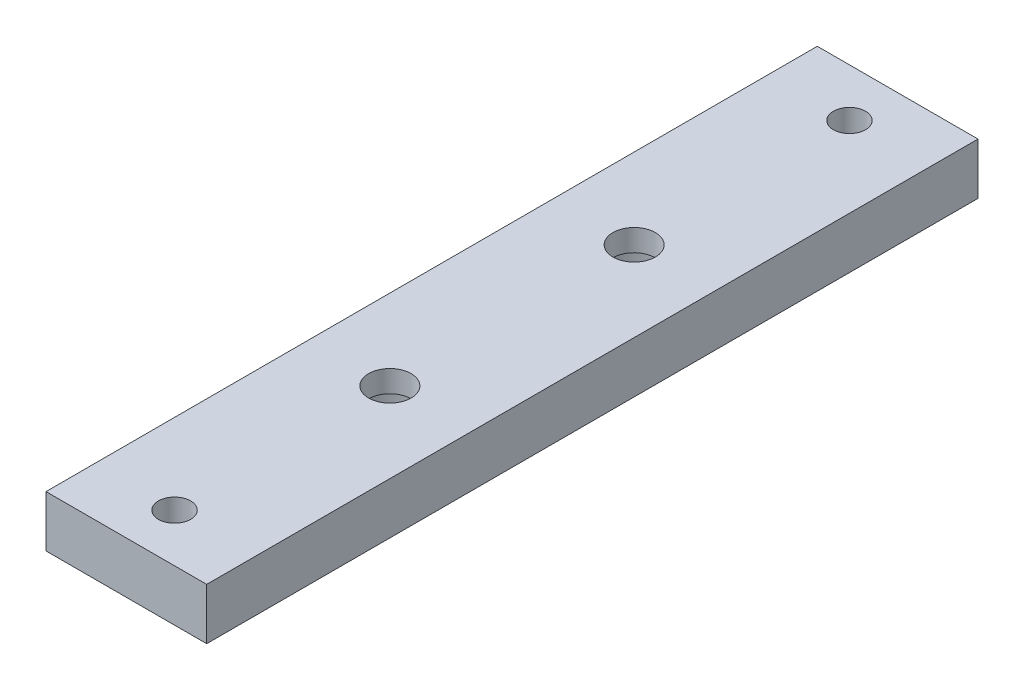
ISO-10303-21;
HEADER;
FILE_DESCRIPTION(('STEP AP214'),'2;1');
FILE_NAME('part.step','',(''),(''),'','','');
FILE_SCHEMA(('AUTOMOTIVE_DESIGN { 1 0 10303 214 1 1 1 1 }'));
ENDSEC;
DATA;
#1=APPLICATION_CONTEXT('core data for automotive mechanical design processes');
#2=APPLICATION_PROTOCOL_DEFINITION('international standard','automotive_design',2000,#1);
#3=PRODUCT_CONTEXT('',#1,'mechanical');
#4=PRODUCT('Part','Part','',(#3));
#5=PRODUCT_RELATED_PRODUCT_CATEGORY('part','',(#4));
#6=PRODUCT_DEFINITION_FORMATION('','',#4);
#7=PRODUCT_DEFINITION_CONTEXT('part definition',#1,'design');
#8=PRODUCT_DEFINITION('design','',#6,#7);
#9=PRODUCT_DEFINITION_SHAPE('','',#8);
#10=(LENGTH_UNIT() NAMED_UNIT(*) SI_UNIT(.MILLI.,.METRE.));
#11=(NAMED_UNIT(*) PLANE_ANGLE_UNIT() SI_UNIT($,.RADIAN.));
#12=(NAMED_UNIT(*) SI_UNIT($,.STERADIAN.) SOLID_ANGLE_UNIT());
#13=UNCERTAINTY_MEASURE_WITH_UNIT(LENGTH_MEASURE(1.E-05),#10,'distance_accuracy_value','');
#14=(GEOMETRIC_REPRESENTATION_CONTEXT(3) GLOBAL_UNCERTAINTY_ASSIGNED_CONTEXT((#13)) GLOBAL_UNIT_ASSIGNED_CONTEXT((#10,
#11,#12)) REPRESENTATION_CONTEXT('',''));
#15=CARTESIAN_POINT('',(0.,0.,0.));
#16=DIRECTION('',(0.,0.,1.));
#17=DIRECTION('',(1.,0.,0.));
#18=AXIS2_PLACEMENT_3D('',#15,#16,#17);
#19=CARTESIAN_POINT('',(12.5,8.,-60.));
#20=DIRECTION('',(-1.,0.,0.));
#21=DIRECTION('',(0.,0.,1.));
#22=AXIS2_PLACEMENT_3D('',#19,#20,#21);
#23=PLANE('',#22);
#24=DIRECTION('',(0.,0.,-1.));
#25=VECTOR('',#24,1.);
#26=CARTESIAN_POINT('',(12.5,0.,-60.));
#27=LINE('',#26,#25);
#28=CARTESIAN_POINT('',(12.5,0.,60.));
#29=VERTEX_POINT('',#28);
#30=CARTESIAN_POINT('',(12.5,0.,-60.));
#31=VERTEX_POINT('',#30);
#32=EDGE_CURVE('E98',#29,#31,#27,.T.);
#33=ORIENTED_EDGE('',*,*,#32,.T.);
#34=DIRECTION('',(0.,-1.,0.));
#35=VECTOR('',#34,1.);
#36=CARTESIAN_POINT('',(12.5,8.,-60.));
#37=LINE('',#36,#35);
#38=CARTESIAN_POINT('',(12.5,8.,-60.));
#39=VERTEX_POINT('',#38);
#40=EDGE_CURVE('E11',#39,#31,#37,.T.);
#41=ORIENTED_EDGE('',*,*,#40,.F.);
#42=DIRECTION('',(0.,0.,-1.));
#43=VECTOR('',#42,1.);
#44=CARTESIAN_POINT('',(12.5,8.,-60.));
#45=LINE('',#44,#43);
#46=CARTESIAN_POINT('',(12.5,8.,60.));
#47=VERTEX_POINT('',#46);
#48=EDGE_CURVE('E86',#47,#39,#45,.T.);
#49=ORIENTED_EDGE('',*,*,#48,.F.);
#50=DIRECTION('',(0.,-1.,0.));
#51=VECTOR('',#50,1.);
#52=CARTESIAN_POINT('',(12.5,8.,60.));
#53=LINE('',#52,#51);
#54=EDGE_CURVE('E94',#47,#29,#53,.T.);
#55=ORIENTED_EDGE('',*,*,#54,.T.);
#56=EDGE_LOOP('',(#33,#41,#49,#55));
#57=FACE_BOUND('',#56,.T.);
#58=ADVANCED_FACE('F35',(#57),#23,.F.);
#59=CARTESIAN_POINT('',(-12.5,8.,-60.));
#60=DIRECTION('',(0.,0.,1.));
#61=DIRECTION('',(1.,0.,0.));
#62=AXIS2_PLACEMENT_3D('',#59,#60,#61);
#63=PLANE('',#62);
#64=DIRECTION('',(-1.,0.,0.));
#65=VECTOR('',#64,1.);
#66=CARTESIAN_POINT('',(-12.5,0.,-60.));
#67=LINE('',#66,#65);
#68=CARTESIAN_POINT('',(-12.5,0.,-60.));
#69=VERTEX_POINT('',#68);
#70=EDGE_CURVE('E90',#31,#69,#67,.T.);
#71=ORIENTED_EDGE('',*,*,#70,.T.);
#72=DIRECTION('',(0.,-1.,0.));
#73=VECTOR('',#72,1.);
#74=CARTESIAN_POINT('',(-12.5,8.,-60.));
#75=LINE('',#74,#73);
#76=CARTESIAN_POINT('',(-12.5,8.,-60.));
#77=VERTEX_POINT('',#76);
#78=EDGE_CURVE('E43',#77,#69,#75,.T.);
#79=ORIENTED_EDGE('',*,*,#78,.F.);
#80=DIRECTION('',(-1.,0.,0.));
#81=VECTOR('',#80,1.);
#82=CARTESIAN_POINT('',(-12.5,8.,-60.));
#83=LINE('',#82,#81);
#84=EDGE_CURVE('E81',#39,#77,#83,.T.);
#85=ORIENTED_EDGE('',*,*,#84,.F.);
#86=ORIENTED_EDGE('',*,*,#40,.T.);
#87=EDGE_LOOP('',(#71,#79,#85,#86));
#88=FACE_BOUND('',#87,.T.);
#89=ADVANCED_FACE('F89',(#88),#63,.F.);
#90=CARTESIAN_POINT('',(-12.5,8.,-60.));
#91=DIRECTION('',(1.,0.,0.));
#92=DIRECTION('',(0.,0.,-1.));
#93=AXIS2_PLACEMENT_3D('',#90,#91,#92);
#94=PLANE('',#93);
#95=DIRECTION('',(0.,0.,1.));
#96=VECTOR('',#95,1.);
#97=CARTESIAN_POINT('',(-12.5,0.,-60.));
#98=LINE('',#97,#96);
#99=CARTESIAN_POINT('',(-12.5,0.,60.));
#100=VERTEX_POINT('',#99);
#101=EDGE_CURVE('E68',#69,#100,#98,.T.);
#102=ORIENTED_EDGE('',*,*,#101,.T.);
#103=DIRECTION('',(0.,-1.,0.));
#104=VECTOR('',#103,1.);
#105=CARTESIAN_POINT('',(-12.5,8.,60.));
#106=LINE('',#105,#104);
#107=CARTESIAN_POINT('',(-12.5,8.,60.));
#108=VERTEX_POINT('',#107);
#109=EDGE_CURVE('E91',#108,#100,#106,.T.);
#110=ORIENTED_EDGE('',*,*,#109,.F.);
#111=DIRECTION('',(0.,0.,1.));
#112=VECTOR('',#111,1.);
#113=CARTESIAN_POINT('',(-12.5,8.,-60.));
#114=LINE('',#113,#112);
#115=EDGE_CURVE('E84',#77,#108,#114,.T.);
#116=ORIENTED_EDGE('',*,*,#115,.F.);
#117=ORIENTED_EDGE('',*,*,#78,.T.);
#118=EDGE_LOOP('',(#102,#110,#116,#117));
#119=FACE_BOUND('',#118,.T.);
#120=ADVANCED_FACE('F92',(#119),#94,.F.);
#121=CARTESIAN_POINT('',(-12.5,8.,60.));
#122=DIRECTION('',(0.,0.,-1.));
#123=DIRECTION('',(-1.,0.,0.));
#124=AXIS2_PLACEMENT_3D('',#121,#122,#123);
#125=PLANE('',#124);
#126=DIRECTION('',(1.,0.,0.));
#127=VECTOR('',#126,1.);
#128=CARTESIAN_POINT('',(-12.5,0.,60.));
#129=LINE('',#128,#127);
#130=EDGE_CURVE('E74',#100,#29,#129,.T.);
#131=ORIENTED_EDGE('',*,*,#130,.T.);
#132=ORIENTED_EDGE('',*,*,#54,.F.);
#133=DIRECTION('',(1.,0.,0.));
#134=VECTOR('',#133,1.);
#135=CARTESIAN_POINT('',(-12.5,8.,60.));
#136=LINE('',#135,#134);
#137=EDGE_CURVE('E51',#108,#47,#136,.T.);
#138=ORIENTED_EDGE('',*,*,#137,.F.);
#139=ORIENTED_EDGE('',*,*,#109,.T.);
#140=EDGE_LOOP('',(#131,#132,#138,#139));
#141=FACE_BOUND('',#140,.T.);
#142=ADVANCED_FACE('F106',(#141),#125,.F.);
#143=CARTESIAN_POINT('',(0.,8.,0.));
#144=DIRECTION('',(0.,1.,0.));
#145=DIRECTION('',(0.,0.,1.));
#146=AXIS2_PLACEMENT_3D('',#143,#144,#145);
#147=PLANE('',#146);
#148=CARTESIAN_POINT('',(0.,8.,19.));
#149=DIRECTION('',(0.,-1.,0.));
#150=DIRECTION('',(0.,0.,-1.));
#151=AXIS2_PLACEMENT_3D('',#148,#149,#150);
#152=CIRCLE('',#151,3.3);
#153=CARTESIAN_POINT('',(0.,8.,15.7));
#154=VERTEX_POINT('',#153);
#155=EDGE_CURVE('E147',#154,#154,#152,.T.);
#156=ORIENTED_EDGE('',*,*,#155,.T.);
#157=EDGE_LOOP('',(#156));
#158=FACE_BOUND('',#157,.T.);
#159=CARTESIAN_POINT('',(0.,8.,-19.));
#160=DIRECTION('',(0.,-1.,0.));
#161=DIRECTION('',(0.,0.,-1.));
#162=AXIS2_PLACEMENT_3D('',#159,#160,#161);
#163=CIRCLE('',#162,3.3);
#164=CARTESIAN_POINT('',(0.,8.,-22.3));
#165=VERTEX_POINT('',#164);
#166=EDGE_CURVE('E135',#165,#165,#163,.T.);
#167=ORIENTED_EDGE('',*,*,#166,.T.);
#168=EDGE_LOOP('',(#167));
#169=FACE_BOUND('',#168,.T.);
#170=CARTESIAN_POINT('',(0.,8.,52.5));
#171=DIRECTION('',(0.,1.,0.));
#172=DIRECTION('',(0.,0.,1.));
#173=AXIS2_PLACEMENT_3D('',#170,#171,#172);
#174=CIRCLE('',#173,2.49999999999999);
#175=CARTESIAN_POINT('',(0.,8.,55.));
#176=VERTEX_POINT('',#175);
#177=EDGE_CURVE('E120',#176,#176,#174,.T.);
#178=ORIENTED_EDGE('',*,*,#177,.F.);
#179=EDGE_LOOP('',(#178));
#180=FACE_BOUND('',#179,.T.);
#181=CARTESIAN_POINT('',(0.,8.,-52.5));
#182=DIRECTION('',(0.,1.,0.));
#183=DIRECTION('',(0.,0.,1.));
#184=AXIS2_PLACEMENT_3D('',#181,#182,#183);
#185=CIRCLE('',#184,2.49999999999999);
#186=CARTESIAN_POINT('',(0.,8.,-50.));
#187=VERTEX_POINT('',#186);
#188=EDGE_CURVE('E114',#187,#187,#185,.T.);
#189=ORIENTED_EDGE('',*,*,#188,.F.);
#190=EDGE_LOOP('',(#189));
#191=FACE_BOUND('',#190,.T.);
#192=ORIENTED_EDGE('',*,*,#48,.T.);
#193=ORIENTED_EDGE('',*,*,#84,.T.);
#194=ORIENTED_EDGE('',*,*,#115,.T.);
#195=ORIENTED_EDGE('',*,*,#137,.T.);
#196=EDGE_LOOP('',(#192,#193,#194,#195));
#197=FACE_BOUND('',#196,.T.);
#198=ADVANCED_FACE('F82',(#158,#169,#180,#191,#197),#147,.T.);
#199=CARTESIAN_POINT('',(0.,0.,0.));
#200=DIRECTION('',(0.,1.,0.));
#201=DIRECTION('',(0.,0.,1.));
#202=AXIS2_PLACEMENT_3D('',#199,#200,#201);
#203=PLANE('',#202);
#204=CARTESIAN_POINT('',(0.,0.,19.));
#205=DIRECTION('',(0.,-1.,0.));
#206=DIRECTION('',(0.,0.,-1.));
#207=AXIS2_PLACEMENT_3D('',#204,#205,#206);
#208=CIRCLE('',#207,7.);
#209=CARTESIAN_POINT('',(0.,0.,12.));
#210=VERTEX_POINT('',#209);
#211=EDGE_CURVE('E156',#210,#210,#208,.T.);
#212=ORIENTED_EDGE('',*,*,#211,.F.);
#213=EDGE_LOOP('',(#212));
#214=FACE_BOUND('',#213,.T.);
#215=CARTESIAN_POINT('',(0.,0.,-19.));
#216=DIRECTION('',(0.,-1.,0.));
#217=DIRECTION('',(0.,0.,-1.));
#218=AXIS2_PLACEMENT_3D('',#215,#216,#217);
#219=CIRCLE('',#218,7.);
#220=CARTESIAN_POINT('',(0.,0.,-26.));
#221=VERTEX_POINT('',#220);
#222=EDGE_CURVE('E144',#221,#221,#219,.T.);
#223=ORIENTED_EDGE('',*,*,#222,.F.);
#224=EDGE_LOOP('',(#223));
#225=FACE_BOUND('',#224,.T.);
#226=CARTESIAN_POINT('',(0.,0.,52.5));
#227=DIRECTION('',(0.,-1.,0.));
#228=DIRECTION('',(0.,0.,-1.));
#229=AXIS2_PLACEMENT_3D('',#226,#227,#228);
#230=CIRCLE('',#229,2.);
#231=CARTESIAN_POINT('',(0.,0.,50.5));
#232=VERTEX_POINT('',#231);
#233=EDGE_CURVE('E132',#232,#232,#230,.T.);
#234=ORIENTED_EDGE('',*,*,#233,.F.);
#235=EDGE_LOOP('',(#234));
#236=FACE_BOUND('',#235,.T.);
#237=CARTESIAN_POINT('',(0.,0.,-52.5));
#238=DIRECTION('',(0.,-1.,0.));
#239=DIRECTION('',(0.,0.,-1.));
#240=AXIS2_PLACEMENT_3D('',#237,#238,#239);
#241=CIRCLE('',#240,2.);
#242=CARTESIAN_POINT('',(0.,0.,-54.5));
#243=VERTEX_POINT('',#242);
#244=EDGE_CURVE('E126',#243,#243,#241,.T.);
#245=ORIENTED_EDGE('',*,*,#244,.F.);
#246=EDGE_LOOP('',(#245));
#247=FACE_BOUND('',#246,.T.);
#248=ORIENTED_EDGE('',*,*,#32,.F.);
#249=ORIENTED_EDGE('',*,*,#130,.F.);
#250=ORIENTED_EDGE('',*,*,#101,.F.);
#251=ORIENTED_EDGE('',*,*,#70,.F.);
#252=EDGE_LOOP('',(#248,#249,#250,#251));
#253=FACE_BOUND('',#252,.T.);
#254=ADVANCED_FACE('F109',(#214,#225,#236,#247,#253),#203,.F.);
#255=CARTESIAN_POINT('',(0.,2.,-52.5));
#256=DIRECTION('',(0.,-1.,0.));
#257=DIRECTION('',(0.,0.,-1.));
#258=AXIS2_PLACEMENT_3D('',#255,#256,#257);
#259=PLANE('',#258);
#260=CARTESIAN_POINT('',(0.,2.,-52.5));
#261=DIRECTION('',(0.,1.,0.));
#262=DIRECTION('',(0.,0.,1.));
#263=AXIS2_PLACEMENT_3D('',#260,#261,#262);
#264=CIRCLE('',#263,2.5);
#265=CARTESIAN_POINT('',(0.,2.,-50.));
#266=VERTEX_POINT('',#265);
#267=EDGE_CURVE('E101',#266,#266,#264,.T.);
#268=ORIENTED_EDGE('',*,*,#267,.T.);
#269=EDGE_LOOP('',(#268));
#270=FACE_BOUND('',#269,.T.);
#271=ADVANCED_FACE('F164',(#270),#259,.F.);
#272=CARTESIAN_POINT('',(0.,8.,-52.5));
#273=DIRECTION('',(0.,1.,0.));
#274=DIRECTION('',(0.,0.,1.));
#275=AXIS2_PLACEMENT_3D('',#272,#273,#274);
#276=CYLINDRICAL_SURFACE('',#275,2.49999999999999);
#277=ORIENTED_EDGE('',*,*,#267,.F.);
#278=EDGE_LOOP('',(#277));
#279=FACE_BOUND('',#278,.T.);
#280=ORIENTED_EDGE('',*,*,#188,.T.);
#281=EDGE_LOOP('',(#280));
#282=FACE_BOUND('',#281,.T.);
#283=ADVANCED_FACE('F205',(#279,#282),#276,.F.);
#284=CARTESIAN_POINT('',(0.,2.,52.5));
#285=DIRECTION('',(0.,-1.,0.));
#286=DIRECTION('',(0.,0.,-1.));
#287=AXIS2_PLACEMENT_3D('',#284,#285,#286);
#288=PLANE('',#287);
#289=CARTESIAN_POINT('',(0.,2.,52.5));
#290=DIRECTION('',(0.,1.,0.));
#291=DIRECTION('',(0.,0.,1.));
#292=AXIS2_PLACEMENT_3D('',#289,#290,#291);
#293=CIRCLE('',#292,2.5);
#294=CARTESIAN_POINT('',(0.,2.,55.));
#295=VERTEX_POINT('',#294);
#296=EDGE_CURVE('E117',#295,#295,#293,.T.);
#297=ORIENTED_EDGE('',*,*,#296,.T.);
#298=EDGE_LOOP('',(#297));
#299=FACE_BOUND('',#298,.T.);
#300=ADVANCED_FACE('F209',(#299),#288,.F.);
#301=CARTESIAN_POINT('',(0.,8.,52.5));
#302=DIRECTION('',(0.,1.,0.));
#303=DIRECTION('',(0.,0.,1.));
#304=AXIS2_PLACEMENT_3D('',#301,#302,#303);
#305=CYLINDRICAL_SURFACE('',#304,2.49999999999999);
#306=ORIENTED_EDGE('',*,*,#296,.F.);
#307=EDGE_LOOP('',(#306));
#308=FACE_BOUND('',#307,.T.);
#309=ORIENTED_EDGE('',*,*,#177,.T.);
#310=EDGE_LOOP('',(#309));
#311=FACE_BOUND('',#310,.T.);
#312=ADVANCED_FACE('F185',(#308,#311),#305,.F.);
#313=CARTESIAN_POINT('',(0.,1.7,-52.5));
#314=DIRECTION('',(0.,1.,0.));
#315=DIRECTION('',(0.,0.,1.));
#316=AXIS2_PLACEMENT_3D('',#313,#314,#315);
#317=PLANE('',#316);
#318=CARTESIAN_POINT('',(0.,1.7,-52.5));
#319=DIRECTION('',(0.,-1.,0.));
#320=DIRECTION('',(0.,0.,-1.));
#321=AXIS2_PLACEMENT_3D('',#318,#319,#320);
#322=CIRCLE('',#321,2.);
#323=CARTESIAN_POINT('',(0.,1.7,-54.5));
#324=VERTEX_POINT('',#323);
#325=EDGE_CURVE('E123',#324,#324,#322,.T.);
#326=ORIENTED_EDGE('',*,*,#325,.T.);
#327=EDGE_LOOP('',(#326));
#328=FACE_BOUND('',#327,.T.);
#329=ADVANCED_FACE('F175',(#328),#317,.F.);
#330=CARTESIAN_POINT('',(0.,0.,-52.5));
#331=DIRECTION('',(0.,-1.,0.));
#332=DIRECTION('',(0.,0.,-1.));
#333=AXIS2_PLACEMENT_3D('',#330,#331,#332);
#334=CYLINDRICAL_SURFACE('',#333,2.);
#335=ORIENTED_EDGE('',*,*,#325,.F.);
#336=EDGE_LOOP('',(#335));
#337=FACE_BOUND('',#336,.T.);
#338=ORIENTED_EDGE('',*,*,#244,.T.);
#339=EDGE_LOOP('',(#338));
#340=FACE_BOUND('',#339,.T.);
#341=ADVANCED_FACE('F172',(#337,#340),#334,.F.);
#342=CARTESIAN_POINT('',(0.,1.7,52.5));
#343=DIRECTION('',(0.,1.,0.));
#344=DIRECTION('',(0.,0.,1.));
#345=AXIS2_PLACEMENT_3D('',#342,#343,#344);
#346=PLANE('',#345);
#347=CARTESIAN_POINT('',(0.,1.7,52.5));
#348=DIRECTION('',(0.,-1.,0.));
#349=DIRECTION('',(0.,0.,-1.));
#350=AXIS2_PLACEMENT_3D('',#347,#348,#349);
#351=CIRCLE('',#350,2.);
#352=CARTESIAN_POINT('',(0.,1.7,50.5));
#353=VERTEX_POINT('',#352);
#354=EDGE_CURVE('E129',#353,#353,#351,.T.);
#355=ORIENTED_EDGE('',*,*,#354,.T.);
#356=EDGE_LOOP('',(#355));
#357=FACE_BOUND('',#356,.T.);
#358=ADVANCED_FACE('F174',(#357),#346,.F.);
#359=CARTESIAN_POINT('',(0.,0.,52.5));
#360=DIRECTION('',(0.,-1.,0.));
#361=DIRECTION('',(0.,0.,-1.));
#362=AXIS2_PLACEMENT_3D('',#359,#360,#361);
#363=CYLINDRICAL_SURFACE('',#362,2.);
#364=ORIENTED_EDGE('',*,*,#354,.F.);
#365=EDGE_LOOP('',(#364));
#366=FACE_BOUND('',#365,.T.);
#367=ORIENTED_EDGE('',*,*,#233,.T.);
#368=EDGE_LOOP('',(#367));
#369=FACE_BOUND('',#368,.T.);
#370=ADVANCED_FACE('F182',(#366,#369),#363,.F.);
#371=CARTESIAN_POINT('',(0.,0.,-19.));
#372=DIRECTION('',(0.,-1.,0.));
#373=DIRECTION('',(0.,0.,-1.));
#374=AXIS2_PLACEMENT_3D('',#371,#372,#373);
#375=CYLINDRICAL_SURFACE('',#374,3.3);
#376=ORIENTED_EDGE('',*,*,#166,.F.);
#377=EDGE_LOOP('',(#376));
#378=FACE_BOUND('',#377,.T.);
#379=CARTESIAN_POINT('',(0.,4.60000000000001,-19.));
#380=DIRECTION('',(0.,-1.,0.));
#381=DIRECTION('',(0.,0.,-1.));
#382=AXIS2_PLACEMENT_3D('',#379,#380,#381);
#383=CIRCLE('',#382,3.3);
#384=CARTESIAN_POINT('',(0.,4.60000000000001,-22.3));
#385=VERTEX_POINT('',#384);
#386=EDGE_CURVE('E138',#385,#385,#383,.T.);
#387=ORIENTED_EDGE('',*,*,#386,.T.);
#388=EDGE_LOOP('',(#387));
#389=FACE_BOUND('',#388,.T.);
#390=ADVANCED_FACE('F250',(#378,#389),#375,.F.);
#391=CARTESIAN_POINT('',(3.30000000000001,4.60000000000001,-19.));
#392=DIRECTION('',(0.,1.,0.));
#393=DIRECTION('',(0.,0.,1.));
#394=AXIS2_PLACEMENT_3D('',#391,#392,#393);
#395=PLANE('',#394);
#396=ORIENTED_EDGE('',*,*,#386,.F.);
#397=EDGE_LOOP('',(#396));
#398=FACE_BOUND('',#397,.T.);
#399=CARTESIAN_POINT('',(0.,4.60000000000001,-19.));
#400=DIRECTION('',(0.,-1.,0.));
#401=DIRECTION('',(0.,0.,-1.));
#402=AXIS2_PLACEMENT_3D('',#399,#400,#401);
#403=CIRCLE('',#402,6.99999999999999);
#404=CARTESIAN_POINT('',(0.,4.60000000000001,-26.));
#405=VERTEX_POINT('',#404);
#406=EDGE_CURVE('E141',#405,#405,#403,.T.);
#407=ORIENTED_EDGE('',*,*,#406,.T.);
#408=EDGE_LOOP('',(#407));
#409=FACE_BOUND('',#408,.T.);
#410=ADVANCED_FACE('F274',(#398,#409),#395,.F.);
#411=CARTESIAN_POINT('',(0.,0.,-19.));
#412=DIRECTION('',(0.,-1.,0.));
#413=DIRECTION('',(0.,0.,-1.));
#414=AXIS2_PLACEMENT_3D('',#411,#412,#413);
#415=CYLINDRICAL_SURFACE('',#414,6.99999999999999);
#416=ORIENTED_EDGE('',*,*,#406,.F.);
#417=EDGE_LOOP('',(#416));
#418=FACE_BOUND('',#417,.T.);
#419=ORIENTED_EDGE('',*,*,#222,.T.);
#420=EDGE_LOOP('',(#419));
#421=FACE_BOUND('',#420,.T.);
#422=ADVANCED_FACE('F284',(#418,#421),#415,.F.);
#423=CARTESIAN_POINT('',(0.,0.,19.));
#424=DIRECTION('',(0.,-1.,0.));
#425=DIRECTION('',(0.,0.,-1.));
#426=AXIS2_PLACEMENT_3D('',#423,#424,#425);
#427=CYLINDRICAL_SURFACE('',#426,3.3);
#428=ORIENTED_EDGE('',*,*,#155,.F.);
#429=EDGE_LOOP('',(#428));
#430=FACE_BOUND('',#429,.T.);
#431=CARTESIAN_POINT('',(0.,4.60000000000001,19.));
#432=DIRECTION('',(0.,-1.,0.));
#433=DIRECTION('',(0.,0.,-1.));
#434=AXIS2_PLACEMENT_3D('',#431,#432,#433);
#435=CIRCLE('',#434,3.3);
#436=CARTESIAN_POINT('',(0.,4.60000000000001,15.7));
#437=VERTEX_POINT('',#436);
#438=EDGE_CURVE('E150',#437,#437,#435,.T.);
#439=ORIENTED_EDGE('',*,*,#438,.T.);
#440=EDGE_LOOP('',(#439));
#441=FACE_BOUND('',#440,.T.);
#442=ADVANCED_FACE('F294',(#430,#441),#427,.F.);
#443=CARTESIAN_POINT('',(3.3,4.60000000000001,19.));
#444=DIRECTION('',(0.,1.,0.));
#445=DIRECTION('',(0.,0.,1.));
#446=AXIS2_PLACEMENT_3D('',#443,#444,#445);
#447=PLANE('',#446);
#448=ORIENTED_EDGE('',*,*,#438,.F.);
#449=EDGE_LOOP('',(#448));
#450=FACE_BOUND('',#449,.T.);
#451=CARTESIAN_POINT('',(0.,4.60000000000001,19.));
#452=DIRECTION('',(0.,-1.,0.));
#453=DIRECTION('',(0.,0.,-1.));
#454=AXIS2_PLACEMENT_3D('',#451,#452,#453);
#455=CIRCLE('',#454,6.99999999999999);
#456=CARTESIAN_POINT('',(0.,4.60000000000001,12.));
#457=VERTEX_POINT('',#456);
#458=EDGE_CURVE('E153',#457,#457,#455,.T.);
#459=ORIENTED_EDGE('',*,*,#458,.T.);
#460=EDGE_LOOP('',(#459));
#461=FACE_BOUND('',#460,.T.);
#462=ADVANCED_FACE('F304',(#450,#461),#447,.F.);
#463=CARTESIAN_POINT('',(0.,0.,19.));
#464=DIRECTION('',(0.,-1.,0.));
#465=DIRECTION('',(0.,0.,-1.));
#466=AXIS2_PLACEMENT_3D('',#463,#464,#465);
#467=CYLINDRICAL_SURFACE('',#466,6.99999999999999);
#468=ORIENTED_EDGE('',*,*,#458,.F.);
#469=EDGE_LOOP('',(#468));
#470=FACE_BOUND('',#469,.T.);
#471=ORIENTED_EDGE('',*,*,#211,.T.);
#472=EDGE_LOOP('',(#471));
#473=FACE_BOUND('',#472,.T.);
#474=ADVANCED_FACE('F160',(#470,#473),#467,.F.);
#475=CLOSED_SHELL('',(#58,#89,#120,#142,#198,#254,#271,#283,#300,#312,#329,#341,#358,#370,#390,
#410,#422,#442,#462,#474));
#476=MANIFOLD_SOLID_BREP('B2',#475);
#477=ADVANCED_BREP_SHAPE_REPRESENTATION('',(#18,#476),#14);
#478=SHAPE_DEFINITION_REPRESENTATION(#9,#477);
ENDSEC;
END-ISO-10303-21;
